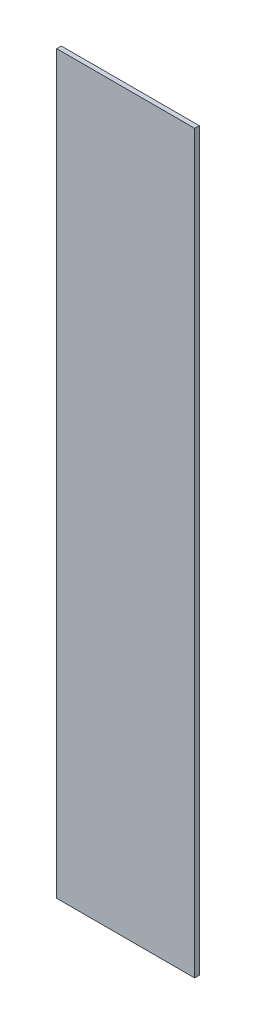
ISO-10303-21;
HEADER;
FILE_DESCRIPTION(('STEP AP214'),'2;1');
FILE_NAME('part.step','',(''),(''),'','','');
FILE_SCHEMA(('AUTOMOTIVE_DESIGN { 1 0 10303 214 1 1 1 1 }'));
ENDSEC;
DATA;
#1=APPLICATION_CONTEXT('core data for automotive mechanical design processes');
#2=APPLICATION_PROTOCOL_DEFINITION('international standard','automotive_design',2000,#1);
#3=PRODUCT_CONTEXT('',#1,'mechanical');
#4=PRODUCT('Part','Part','',(#3));
#5=PRODUCT_RELATED_PRODUCT_CATEGORY('part','',(#4));
#6=PRODUCT_DEFINITION_FORMATION('','',#4);
#7=PRODUCT_DEFINITION_CONTEXT('part definition',#1,'design');
#8=PRODUCT_DEFINITION('design','',#6,#7);
#9=PRODUCT_DEFINITION_SHAPE('','',#8);
#10=(LENGTH_UNIT() NAMED_UNIT(*) SI_UNIT(.MILLI.,.METRE.));
#11=(NAMED_UNIT(*) PLANE_ANGLE_UNIT() SI_UNIT($,.RADIAN.));
#12=(NAMED_UNIT(*) SI_UNIT($,.STERADIAN.) SOLID_ANGLE_UNIT());
#13=UNCERTAINTY_MEASURE_WITH_UNIT(LENGTH_MEASURE(1.E-05),#10,'distance_accuracy_value','');
#14=(GEOMETRIC_REPRESENTATION_CONTEXT(3) GLOBAL_UNCERTAINTY_ASSIGNED_CONTEXT((#13)) GLOBAL_UNIT_ASSIGNED_CONTEXT((#10,
#11,#12)) REPRESENTATION_CONTEXT('',''));
#15=CARTESIAN_POINT('',(0.,0.,0.));
#16=DIRECTION('',(0.,0.,1.));
#17=DIRECTION('',(1.,0.,0.));
#18=AXIS2_PLACEMENT_3D('',#15,#16,#17);
#19=CARTESIAN_POINT('',(74.9999999999999,400.,5.));
#20=DIRECTION('',(-1.,0.,0.));
#21=DIRECTION('',(0.,-1.,0.));
#22=AXIS2_PLACEMENT_3D('',#19,#20,#21);
#23=PLANE('',#22);
#24=DIRECTION('',(0.,1.,0.));
#25=VECTOR('',#24,1.);
#26=CARTESIAN_POINT('',(74.9999999999999,400.,0.));
#27=LINE('',#26,#25);
#28=CARTESIAN_POINT('',(75.0000000000001,-400.,0.));
#29=VERTEX_POINT('',#28);
#30=CARTESIAN_POINT('',(74.9999999999999,400.,0.));
#31=VERTEX_POINT('',#30);
#32=EDGE_CURVE('E96',#29,#31,#27,.T.);
#33=ORIENTED_EDGE('',*,*,#32,.T.);
#34=DIRECTION('',(0.,0.,-1.));
#35=VECTOR('',#34,1.);
#36=CARTESIAN_POINT('',(74.9999999999999,400.,5.));
#37=LINE('',#36,#35);
#38=CARTESIAN_POINT('',(74.9999999999999,400.,5.));
#39=VERTEX_POINT('',#38);
#40=EDGE_CURVE('E11',#39,#31,#37,.T.);
#41=ORIENTED_EDGE('',*,*,#40,.F.);
#42=DIRECTION('',(0.,1.,0.));
#43=VECTOR('',#42,1.);
#44=CARTESIAN_POINT('',(74.9999999999999,400.,5.));
#45=LINE('',#44,#43);
#46=CARTESIAN_POINT('',(75.0000000000001,-400.,5.));
#47=VERTEX_POINT('',#46);
#48=EDGE_CURVE('E84',#47,#39,#45,.T.);
#49=ORIENTED_EDGE('',*,*,#48,.F.);
#50=DIRECTION('',(0.,0.,-1.));
#51=VECTOR('',#50,1.);
#52=CARTESIAN_POINT('',(75.0000000000001,-400.,5.));
#53=LINE('',#52,#51);
#54=EDGE_CURVE('E92',#47,#29,#53,.T.);
#55=ORIENTED_EDGE('',*,*,#54,.T.);
#56=EDGE_LOOP('',(#33,#41,#49,#55));
#57=FACE_BOUND('',#56,.T.);
#58=ADVANCED_FACE('F33',(#57),#23,.F.);
#59=CARTESIAN_POINT('',(-75.0000000000001,400.,5.));
#60=DIRECTION('',(0.,-1.,0.));
#61=DIRECTION('',(0.,0.,-1.));
#62=AXIS2_PLACEMENT_3D('',#59,#60,#61);
#63=PLANE('',#62);
#64=DIRECTION('',(-1.,0.,0.));
#65=VECTOR('',#64,1.);
#66=CARTESIAN_POINT('',(-75.0000000000001,400.,0.));
#67=LINE('',#66,#65);
#68=CARTESIAN_POINT('',(-75.0000000000001,400.,0.));
#69=VERTEX_POINT('',#68);
#70=EDGE_CURVE('E88',#31,#69,#67,.T.);
#71=ORIENTED_EDGE('',*,*,#70,.T.);
#72=DIRECTION('',(0.,0.,-1.));
#73=VECTOR('',#72,1.);
#74=CARTESIAN_POINT('',(-75.0000000000001,400.,5.));
#75=LINE('',#74,#73);
#76=CARTESIAN_POINT('',(-75.0000000000001,400.,5.));
#77=VERTEX_POINT('',#76);
#78=EDGE_CURVE('E41',#77,#69,#75,.T.);
#79=ORIENTED_EDGE('',*,*,#78,.F.);
#80=DIRECTION('',(-1.,0.,0.));
#81=VECTOR('',#80,1.);
#82=CARTESIAN_POINT('',(-75.0000000000001,400.,5.));
#83=LINE('',#82,#81);
#84=EDGE_CURVE('E79',#39,#77,#83,.T.);
#85=ORIENTED_EDGE('',*,*,#84,.F.);
#86=ORIENTED_EDGE('',*,*,#40,.T.);
#87=EDGE_LOOP('',(#71,#79,#85,#86));
#88=FACE_BOUND('',#87,.T.);
#89=ADVANCED_FACE('F87',(#88),#63,.F.);
#90=CARTESIAN_POINT('',(-75.0000000000001,400.,5.));
#91=DIRECTION('',(1.,0.,0.));
#92=DIRECTION('',(0.,1.,0.));
#93=AXIS2_PLACEMENT_3D('',#90,#91,#92);
#94=PLANE('',#93);
#95=DIRECTION('',(0.,-1.,0.));
#96=VECTOR('',#95,1.);
#97=CARTESIAN_POINT('',(-75.0000000000001,400.,0.));
#98=LINE('',#97,#96);
#99=CARTESIAN_POINT('',(-74.9999999999999,-400.,0.));
#100=VERTEX_POINT('',#99);
#101=EDGE_CURVE('E66',#69,#100,#98,.T.);
#102=ORIENTED_EDGE('',*,*,#101,.T.);
#103=DIRECTION('',(0.,0.,-1.));
#104=VECTOR('',#103,1.);
#105=CARTESIAN_POINT('',(-74.9999999999999,-400.,5.));
#106=LINE('',#105,#104);
#107=CARTESIAN_POINT('',(-74.9999999999999,-400.,5.));
#108=VERTEX_POINT('',#107);
#109=EDGE_CURVE('E89',#108,#100,#106,.T.);
#110=ORIENTED_EDGE('',*,*,#109,.F.);
#111=DIRECTION('',(0.,-1.,0.));
#112=VECTOR('',#111,1.);
#113=CARTESIAN_POINT('',(-75.0000000000001,400.,5.));
#114=LINE('',#113,#112);
#115=EDGE_CURVE('E82',#77,#108,#114,.T.);
#116=ORIENTED_EDGE('',*,*,#115,.F.);
#117=ORIENTED_EDGE('',*,*,#78,.T.);
#118=EDGE_LOOP('',(#102,#110,#116,#117));
#119=FACE_BOUND('',#118,.T.);
#120=ADVANCED_FACE('F90',(#119),#94,.F.);
#121=CARTESIAN_POINT('',(-74.9999999999999,-400.,5.));
#122=DIRECTION('',(0.,1.,0.));
#123=DIRECTION('',(0.,0.,1.));
#124=AXIS2_PLACEMENT_3D('',#121,#122,#123);
#125=PLANE('',#124);
#126=DIRECTION('',(1.,0.,0.));
#127=VECTOR('',#126,1.);
#128=CARTESIAN_POINT('',(-74.9999999999999,-400.,0.));
#129=LINE('',#128,#127);
#130=EDGE_CURVE('E72',#100,#29,#129,.T.);
#131=ORIENTED_EDGE('',*,*,#130,.T.);
#132=ORIENTED_EDGE('',*,*,#54,.F.);
#133=DIRECTION('',(1.,0.,0.));
#134=VECTOR('',#133,1.);
#135=CARTESIAN_POINT('',(-74.9999999999999,-400.,5.));
#136=LINE('',#135,#134);
#137=EDGE_CURVE('E49',#108,#47,#136,.T.);
#138=ORIENTED_EDGE('',*,*,#137,.F.);
#139=ORIENTED_EDGE('',*,*,#109,.T.);
#140=EDGE_LOOP('',(#131,#132,#138,#139));
#141=FACE_BOUND('',#140,.T.);
#142=ADVANCED_FACE('F103',(#141),#125,.F.);
#143=CARTESIAN_POINT('',(0.,0.,5.));
#144=DIRECTION('',(0.,0.,1.));
#145=DIRECTION('',(1.,0.,0.));
#146=AXIS2_PLACEMENT_3D('',#143,#144,#145);
#147=PLANE('',#146);
#148=ORIENTED_EDGE('',*,*,#48,.T.);
#149=ORIENTED_EDGE('',*,*,#84,.T.);
#150=ORIENTED_EDGE('',*,*,#115,.T.);
#151=ORIENTED_EDGE('',*,*,#137,.T.);
#152=EDGE_LOOP('',(#148,#149,#150,#151));
#153=FACE_BOUND('',#152,.T.);
#154=ADVANCED_FACE('F80',(#153),#147,.T.);
#155=CARTESIAN_POINT('',(0.,0.,0.));
#156=DIRECTION('',(0.,0.,1.));
#157=DIRECTION('',(1.,0.,0.));
#158=AXIS2_PLACEMENT_3D('',#155,#156,#157);
#159=PLANE('',#158);
#160=ORIENTED_EDGE('',*,*,#32,.F.);
#161=ORIENTED_EDGE('',*,*,#130,.F.);
#162=ORIENTED_EDGE('',*,*,#101,.F.);
#163=ORIENTED_EDGE('',*,*,#70,.F.);
#164=EDGE_LOOP('',(#160,#161,#162,#163));
#165=FACE_BOUND('',#164,.T.);
#166=ADVANCED_FACE('F106',(#165),#159,.F.);
#167=CLOSED_SHELL('',(#58,#89,#120,#142,#154,#166));
#168=MANIFOLD_SOLID_BREP('B2',#167);
#169=ADVANCED_BREP_SHAPE_REPRESENTATION('',(#18,#168),#14);
#170=SHAPE_DEFINITION_REPRESENTATION(#9,#169);
ENDSEC;
END-ISO-10303-21;
